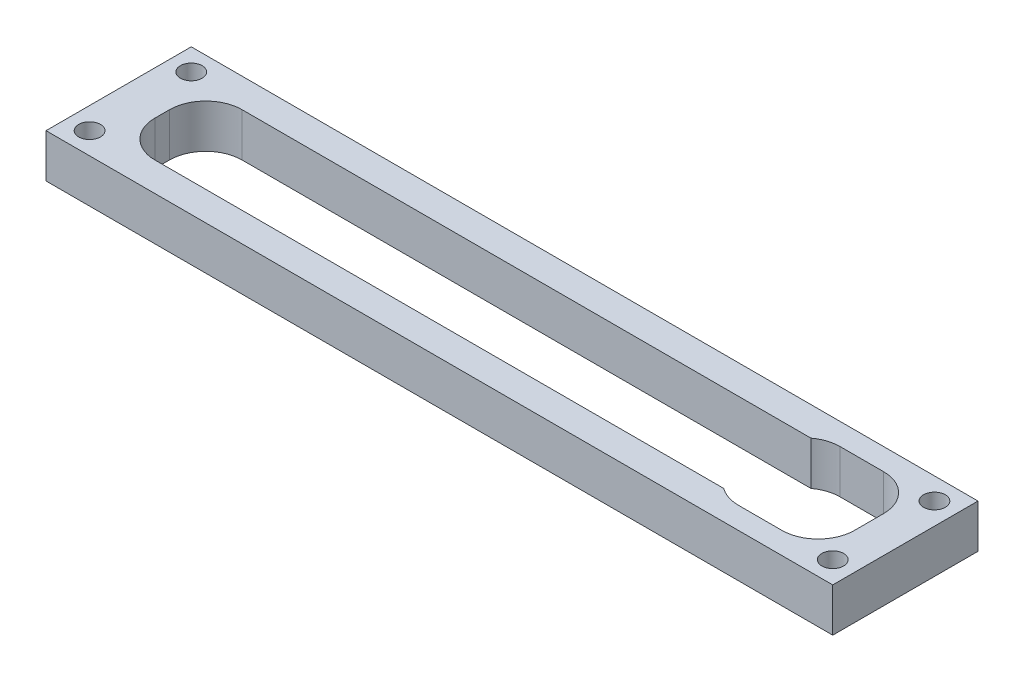
ISO-10303-21;
HEADER;
FILE_DESCRIPTION(('STEP AP214'),'2;1');
FILE_NAME('part.step','',(''),(''),'','','');
FILE_SCHEMA(('AUTOMOTIVE_DESIGN { 1 0 10303 214 1 1 1 1 }'));
ENDSEC;
DATA;
#1=APPLICATION_CONTEXT('core data for automotive mechanical design processes');
#2=APPLICATION_PROTOCOL_DEFINITION('international standard','automotive_design',2000,#1);
#3=PRODUCT_CONTEXT('',#1,'mechanical');
#4=PRODUCT('Part','Part','',(#3));
#5=PRODUCT_RELATED_PRODUCT_CATEGORY('part','',(#4));
#6=PRODUCT_DEFINITION_FORMATION('','',#4);
#7=PRODUCT_DEFINITION_CONTEXT('part definition',#1,'design');
#8=PRODUCT_DEFINITION('design','',#6,#7);
#9=PRODUCT_DEFINITION_SHAPE('','',#8);
#10=(LENGTH_UNIT() NAMED_UNIT(*) SI_UNIT(.MILLI.,.METRE.));
#11=(NAMED_UNIT(*) PLANE_ANGLE_UNIT() SI_UNIT($,.RADIAN.));
#12=(NAMED_UNIT(*) SI_UNIT($,.STERADIAN.) SOLID_ANGLE_UNIT());
#13=UNCERTAINTY_MEASURE_WITH_UNIT(LENGTH_MEASURE(1.E-05),#10,'distance_accuracy_value','');
#14=(GEOMETRIC_REPRESENTATION_CONTEXT(3) GLOBAL_UNCERTAINTY_ASSIGNED_CONTEXT((#13)) GLOBAL_UNIT_ASSIGNED_CONTEXT((#10,
#11,#12)) REPRESENTATION_CONTEXT('',''));
#15=CARTESIAN_POINT('',(0.,0.,0.));
#16=DIRECTION('',(0.,0.,1.));
#17=DIRECTION('',(1.,0.,0.));
#18=AXIS2_PLACEMENT_3D('',#15,#16,#17);
#19=CARTESIAN_POINT('',(0.,6.,0.));
#20=DIRECTION('',(0.,-1.,0.));
#21=DIRECTION('',(0.,0.,-1.));
#22=AXIS2_PLACEMENT_3D('',#19,#20,#21);
#23=PLANE('',#22);
#24=DIRECTION('',(0.,0.,1.));
#25=VECTOR('',#24,1.);
#26=CARTESIAN_POINT('',(0.,6.,0.));
#27=LINE('',#26,#25);
#28=CARTESIAN_POINT('',(0.,6.,-20.));
#29=VERTEX_POINT('',#28);
#30=CARTESIAN_POINT('',(0.,6.,0.));
#31=VERTEX_POINT('',#30);
#32=EDGE_CURVE('E250',#29,#31,#27,.T.);
#33=ORIENTED_EDGE('',*,*,#32,.T.);
#34=DIRECTION('',(1.,0.,0.));
#35=VECTOR('',#34,1.);
#36=CARTESIAN_POINT('',(0.,6.,0.));
#37=LINE('',#36,#35);
#38=CARTESIAN_POINT('',(108.320866353641,6.,0.));
#39=VERTEX_POINT('',#38);
#40=EDGE_CURVE('E253',#31,#39,#37,.T.);
#41=ORIENTED_EDGE('',*,*,#40,.T.);
#42=DIRECTION('',(0.,0.,-1.));
#43=VECTOR('',#42,1.);
#44=CARTESIAN_POINT('',(108.320866353641,6.,0.));
#45=LINE('',#44,#43);
#46=CARTESIAN_POINT('',(108.320866353641,6.,-20.));
#47=VERTEX_POINT('',#46);
#48=EDGE_CURVE('E256',#39,#47,#45,.T.);
#49=ORIENTED_EDGE('',*,*,#48,.T.);
#50=DIRECTION('',(-1.,0.,0.));
#51=VECTOR('',#50,1.);
#52=CARTESIAN_POINT('',(0.,6.,-20.));
#53=LINE('',#52,#51);
#54=EDGE_CURVE('E258',#47,#29,#53,.T.);
#55=ORIENTED_EDGE('',*,*,#54,.T.);
#56=EDGE_LOOP('',(#33,#41,#49,#55));
#57=FACE_BOUND('',#56,.T.);
#58=DIRECTION('',(-1.,0.,0.));
#59=VECTOR('',#58,1.);
#60=CARTESIAN_POINT('',(5.99999999999999,6.,-16.));
#61=LINE('',#60,#59);
#62=CARTESIAN_POINT('',(89.3208663536412,6.,-16.));
#63=VERTEX_POINT('',#62);
#64=CARTESIAN_POINT('',(11.,6.,-16.));
#65=VERTEX_POINT('',#64);
#66=EDGE_CURVE('E243',#63,#65,#61,.T.);
#67=ORIENTED_EDGE('',*,*,#66,.F.);
#68=CARTESIAN_POINT('',(92.3208663536412,6.,-12.));
#69=DIRECTION('',(0.,-1.,0.));
#70=DIRECTION('',(0.,0.,-1.));
#71=AXIS2_PLACEMENT_3D('',#68,#69,#70);
#72=CIRCLE('',#71,5.);
#73=CARTESIAN_POINT('',(92.3208663536412,6.,-17.));
#74=VERTEX_POINT('',#73);
#75=EDGE_CURVE('E193',#63,#74,#72,.T.);
#76=ORIENTED_EDGE('',*,*,#75,.T.);
#77=DIRECTION('',(-1.,0.,0.));
#78=VECTOR('',#77,1.);
#79=CARTESIAN_POINT('',(89.3208663536412,6.,-17.));
#80=LINE('',#79,#78);
#81=CARTESIAN_POINT('',(98.3208663536412,6.,-17.));
#82=VERTEX_POINT('',#81);
#83=EDGE_CURVE('E205',#82,#74,#80,.T.);
#84=ORIENTED_EDGE('',*,*,#83,.F.);
#85=CARTESIAN_POINT('',(98.3208663536412,6.,-12.));
#86=DIRECTION('',(0.,-1.,0.));
#87=DIRECTION('',(0.,0.,-1.));
#88=AXIS2_PLACEMENT_3D('',#85,#86,#87);
#89=CIRCLE('',#88,5.);
#90=CARTESIAN_POINT('',(103.320866353641,6.,-12.));
#91=VERTEX_POINT('',#90);
#92=EDGE_CURVE('E185',#82,#91,#89,.T.);
#93=ORIENTED_EDGE('',*,*,#92,.T.);
#94=DIRECTION('',(0.,0.,-1.));
#95=VECTOR('',#94,1.);
#96=CARTESIAN_POINT('',(103.320866353641,6.,-17.));
#97=LINE('',#96,#95);
#98=CARTESIAN_POINT('',(103.320866353641,6.,-8.00000000000001));
#99=VERTEX_POINT('',#98);
#100=EDGE_CURVE('E202',#99,#91,#97,.T.);
#101=ORIENTED_EDGE('',*,*,#100,.F.);
#102=CARTESIAN_POINT('',(98.3208663536412,6.,-8.00000000000001));
#103=DIRECTION('',(0.,-1.,0.));
#104=DIRECTION('',(0.,0.,-1.));
#105=AXIS2_PLACEMENT_3D('',#102,#103,#104);
#106=CIRCLE('',#105,5.);
#107=CARTESIAN_POINT('',(98.3208663536412,6.,-3.00000000000001));
#108=VERTEX_POINT('',#107);
#109=EDGE_CURVE('E189',#99,#108,#106,.T.);
#110=ORIENTED_EDGE('',*,*,#109,.T.);
#111=DIRECTION('',(1.,0.,0.));
#112=VECTOR('',#111,1.);
#113=CARTESIAN_POINT('',(89.3208663536412,6.,-3.00000000000001));
#114=LINE('',#113,#112);
#115=CARTESIAN_POINT('',(92.3208663536412,6.,-3.00000000000001));
#116=VERTEX_POINT('',#115);
#117=EDGE_CURVE('E200',#116,#108,#114,.T.);
#118=ORIENTED_EDGE('',*,*,#117,.F.);
#119=CARTESIAN_POINT('',(92.3208663536412,6.,-8.00000000000001));
#120=DIRECTION('',(0.,-1.,0.));
#121=DIRECTION('',(0.,0.,-1.));
#122=AXIS2_PLACEMENT_3D('',#119,#120,#121);
#123=CIRCLE('',#122,5.);
#124=CARTESIAN_POINT('',(89.3208663536412,6.,-4.00000000000002));
#125=VERTEX_POINT('',#124);
#126=EDGE_CURVE('E43',#116,#125,#123,.T.);
#127=ORIENTED_EDGE('',*,*,#126,.T.);
#128=DIRECTION('',(1.,0.,0.));
#129=VECTOR('',#128,1.);
#130=CARTESIAN_POINT('',(5.99999999999999,6.,-4.00000000000002));
#131=LINE('',#130,#129);
#132=CARTESIAN_POINT('',(11.,6.,-4.00000000000002));
#133=VERTEX_POINT('',#132);
#134=EDGE_CURVE('E162',#133,#125,#131,.T.);
#135=ORIENTED_EDGE('',*,*,#134,.F.);
#136=CARTESIAN_POINT('',(11.,6.,-9.00000000000001));
#137=DIRECTION('',(0.,-1.,0.));
#138=DIRECTION('',(0.,0.,-1.));
#139=AXIS2_PLACEMENT_3D('',#136,#137,#138);
#140=CIRCLE('',#139,5.);
#141=CARTESIAN_POINT('',(5.99999999999999,6.,-9.00000000000001));
#142=VERTEX_POINT('',#141);
#143=EDGE_CURVE('E179',#133,#142,#140,.T.);
#144=ORIENTED_EDGE('',*,*,#143,.T.);
#145=DIRECTION('',(0.,0.,1.));
#146=VECTOR('',#145,1.);
#147=CARTESIAN_POINT('',(5.99999999999999,6.,-16.));
#148=LINE('',#147,#146);
#149=CARTESIAN_POINT('',(5.99999999999999,6.,-11.));
#150=VERTEX_POINT('',#149);
#151=EDGE_CURVE('E239',#150,#142,#148,.T.);
#152=ORIENTED_EDGE('',*,*,#151,.F.);
#153=CARTESIAN_POINT('',(11.,6.,-11.));
#154=DIRECTION('',(0.,-1.,0.));
#155=DIRECTION('',(0.,0.,-1.));
#156=AXIS2_PLACEMENT_3D('',#153,#154,#155);
#157=CIRCLE('',#156,5.);
#158=EDGE_CURVE('E183',#150,#65,#157,.T.);
#159=ORIENTED_EDGE('',*,*,#158,.T.);
#160=EDGE_LOOP('',(#67,#76,#84,#93,#101,#110,#118,#127,#135,#144,#152,#159));
#161=FACE_BOUND('',#160,.T.);
#162=CARTESIAN_POINT('',(3.,6.,-17.));
#163=DIRECTION('',(0.,1.,0.));
#164=DIRECTION('',(0.,0.,1.));
#165=AXIS2_PLACEMENT_3D('',#162,#163,#164);
#166=CIRCLE('',#165,1.5);
#167=CARTESIAN_POINT('',(3.,6.,-15.5));
#168=VERTEX_POINT('',#167);
#169=EDGE_CURVE('E234',#168,#168,#166,.T.);
#170=ORIENTED_EDGE('',*,*,#169,.F.);
#171=EDGE_LOOP('',(#170));
#172=FACE_BOUND('',#171,.T.);
#173=CARTESIAN_POINT('',(3.,6.,-3.));
#174=DIRECTION('',(0.,1.,0.));
#175=DIRECTION('',(0.,0.,-1.));
#176=AXIS2_PLACEMENT_3D('',#173,#174,#175);
#177=CIRCLE('',#176,1.5);
#178=CARTESIAN_POINT('',(3.,6.,-4.5));
#179=VERTEX_POINT('',#178);
#180=EDGE_CURVE('E228',#179,#179,#177,.T.);
#181=ORIENTED_EDGE('',*,*,#180,.F.);
#182=EDGE_LOOP('',(#181));
#183=FACE_BOUND('',#182,.T.);
#184=CARTESIAN_POINT('',(105.320866353641,6.,-3.00000000000001));
#185=DIRECTION('',(0.,1.,0.));
#186=DIRECTION('',(0.,0.,1.));
#187=AXIS2_PLACEMENT_3D('',#184,#185,#186);
#188=CIRCLE('',#187,1.5);
#189=CARTESIAN_POINT('',(105.320866353641,6.,-1.50000000000001));
#190=VERTEX_POINT('',#189);
#191=EDGE_CURVE('E222',#190,#190,#188,.T.);
#192=ORIENTED_EDGE('',*,*,#191,.F.);
#193=EDGE_LOOP('',(#192));
#194=FACE_BOUND('',#193,.T.);
#195=CARTESIAN_POINT('',(105.320866353641,6.,-17.));
#196=DIRECTION('',(0.,1.,0.));
#197=DIRECTION('',(0.,0.,-1.));
#198=AXIS2_PLACEMENT_3D('',#195,#196,#197);
#199=CIRCLE('',#198,1.5);
#200=CARTESIAN_POINT('',(105.320866353641,6.,-18.5));
#201=VERTEX_POINT('',#200);
#202=EDGE_CURVE('E216',#201,#201,#199,.T.);
#203=ORIENTED_EDGE('',*,*,#202,.F.);
#204=EDGE_LOOP('',(#203));
#205=FACE_BOUND('',#204,.T.);
#206=ADVANCED_FACE('F35',(#57,#161,#172,#183,#194,#205),#23,.F.);
#207=CARTESIAN_POINT('',(0.,0.,0.));
#208=DIRECTION('',(0.,-1.,0.));
#209=DIRECTION('',(0.,0.,-1.));
#210=AXIS2_PLACEMENT_3D('',#207,#208,#209);
#211=PLANE('',#210);
#212=DIRECTION('',(-1.,0.,0.));
#213=VECTOR('',#212,1.);
#214=CARTESIAN_POINT('',(89.3208663536412,0.,-17.));
#215=LINE('',#214,#213);
#216=CARTESIAN_POINT('',(98.3208663536412,0.,-17.));
#217=VERTEX_POINT('',#216);
#218=CARTESIAN_POINT('',(92.3208663536412,0.,-17.));
#219=VERTEX_POINT('',#218);
#220=EDGE_CURVE('E165',#217,#219,#215,.T.);
#221=ORIENTED_EDGE('',*,*,#220,.T.);
#222=CARTESIAN_POINT('',(92.3208663536412,0.,-12.));
#223=DIRECTION('',(0.,-1.,0.));
#224=DIRECTION('',(0.,0.,-1.));
#225=AXIS2_PLACEMENT_3D('',#222,#223,#224);
#226=CIRCLE('',#225,5.);
#227=CARTESIAN_POINT('',(89.3208663536412,0.,-16.));
#228=VERTEX_POINT('',#227);
#229=EDGE_CURVE('E195',#219,#228,#226,.F.);
#230=ORIENTED_EDGE('',*,*,#229,.T.);
#231=DIRECTION('',(-1.,0.,0.));
#232=VECTOR('',#231,1.);
#233=CARTESIAN_POINT('',(5.99999999999999,0.,-16.));
#234=LINE('',#233,#232);
#235=CARTESIAN_POINT('',(11.,0.,-16.));
#236=VERTEX_POINT('',#235);
#237=EDGE_CURVE('E154',#228,#236,#234,.T.);
#238=ORIENTED_EDGE('',*,*,#237,.T.);
#239=CARTESIAN_POINT('',(11.,0.,-11.));
#240=DIRECTION('',(0.,-1.,0.));
#241=DIRECTION('',(0.,0.,-1.));
#242=AXIS2_PLACEMENT_3D('',#239,#240,#241);
#243=CIRCLE('',#242,5.);
#244=CARTESIAN_POINT('',(5.99999999999999,0.,-11.));
#245=VERTEX_POINT('',#244);
#246=EDGE_CURVE('E181',#236,#245,#243,.F.);
#247=ORIENTED_EDGE('',*,*,#246,.T.);
#248=DIRECTION('',(0.,0.,1.));
#249=VECTOR('',#248,1.);
#250=CARTESIAN_POINT('',(5.99999999999999,0.,-16.));
#251=LINE('',#250,#249);
#252=CARTESIAN_POINT('',(5.99999999999999,0.,-9.00000000000001));
#253=VERTEX_POINT('',#252);
#254=EDGE_CURVE('E155',#245,#253,#251,.T.);
#255=ORIENTED_EDGE('',*,*,#254,.T.);
#256=CARTESIAN_POINT('',(11.,0.,-9.00000000000001));
#257=DIRECTION('',(0.,-1.,0.));
#258=DIRECTION('',(0.,0.,-1.));
#259=AXIS2_PLACEMENT_3D('',#256,#257,#258);
#260=CIRCLE('',#259,5.);
#261=CARTESIAN_POINT('',(11.,0.,-4.00000000000002));
#262=VERTEX_POINT('',#261);
#263=EDGE_CURVE('E151',#253,#262,#260,.F.);
#264=ORIENTED_EDGE('',*,*,#263,.T.);
#265=DIRECTION('',(1.,0.,0.));
#266=VECTOR('',#265,1.);
#267=CARTESIAN_POINT('',(5.99999999999999,0.,-4.00000000000002));
#268=LINE('',#267,#266);
#269=CARTESIAN_POINT('',(89.3208663536412,0.,-4.00000000000002));
#270=VERTEX_POINT('',#269);
#271=EDGE_CURVE('E145',#262,#270,#268,.T.);
#272=ORIENTED_EDGE('',*,*,#271,.T.);
#273=CARTESIAN_POINT('',(92.3208663536412,0.,-8.00000000000001));
#274=DIRECTION('',(0.,-1.,0.));
#275=DIRECTION('',(0.,0.,-1.));
#276=AXIS2_PLACEMENT_3D('',#273,#274,#275);
#277=CIRCLE('',#276,5.);
#278=CARTESIAN_POINT('',(92.3208663536412,0.,-3.00000000000001));
#279=VERTEX_POINT('',#278);
#280=EDGE_CURVE('E11',#270,#279,#277,.F.);
#281=ORIENTED_EDGE('',*,*,#280,.T.);
#282=DIRECTION('',(1.,0.,0.));
#283=VECTOR('',#282,1.);
#284=CARTESIAN_POINT('',(89.3208663536412,0.,-3.00000000000001));
#285=LINE('',#284,#283);
#286=CARTESIAN_POINT('',(98.3208663536412,0.,-3.00000000000001));
#287=VERTEX_POINT('',#286);
#288=EDGE_CURVE('E212',#279,#287,#285,.T.);
#289=ORIENTED_EDGE('',*,*,#288,.T.);
#290=CARTESIAN_POINT('',(98.3208663536412,0.,-8.00000000000001));
#291=DIRECTION('',(0.,-1.,0.));
#292=DIRECTION('',(0.,0.,-1.));
#293=AXIS2_PLACEMENT_3D('',#290,#291,#292);
#294=CIRCLE('',#293,5.);
#295=CARTESIAN_POINT('',(103.320866353641,0.,-8.00000000000001));
#296=VERTEX_POINT('',#295);
#297=EDGE_CURVE('E191',#287,#296,#294,.F.);
#298=ORIENTED_EDGE('',*,*,#297,.T.);
#299=DIRECTION('',(0.,0.,-1.));
#300=VECTOR('',#299,1.);
#301=CARTESIAN_POINT('',(103.320866353641,0.,-17.));
#302=LINE('',#301,#300);
#303=CARTESIAN_POINT('',(103.320866353641,0.,-12.));
#304=VERTEX_POINT('',#303);
#305=EDGE_CURVE('E300',#296,#304,#302,.T.);
#306=ORIENTED_EDGE('',*,*,#305,.T.);
#307=CARTESIAN_POINT('',(98.3208663536412,0.,-12.));
#308=DIRECTION('',(0.,-1.,0.));
#309=DIRECTION('',(0.,0.,-1.));
#310=AXIS2_PLACEMENT_3D('',#307,#308,#309);
#311=CIRCLE('',#310,5.);
#312=EDGE_CURVE('E187',#304,#217,#311,.F.);
#313=ORIENTED_EDGE('',*,*,#312,.T.);
#314=EDGE_LOOP('',(#221,#230,#238,#247,#255,#264,#272,#281,#289,#298,#306,#313));
#315=FACE_BOUND('',#314,.T.);
#316=CARTESIAN_POINT('',(105.320866353641,0.,-3.00000000000001));
#317=DIRECTION('',(0.,1.,0.));
#318=DIRECTION('',(0.,0.,1.));
#319=AXIS2_PLACEMENT_3D('',#316,#317,#318);
#320=CIRCLE('',#319,1.5);
#321=CARTESIAN_POINT('',(105.320866353641,0.,-1.50000000000001));
#322=VERTEX_POINT('',#321);
#323=EDGE_CURVE('E219',#322,#322,#320,.T.);
#324=ORIENTED_EDGE('',*,*,#323,.T.);
#325=EDGE_LOOP('',(#324));
#326=FACE_BOUND('',#325,.T.);
#327=CARTESIAN_POINT('',(3.,0.,-17.));
#328=DIRECTION('',(0.,1.,0.));
#329=DIRECTION('',(0.,0.,1.));
#330=AXIS2_PLACEMENT_3D('',#327,#328,#329);
#331=CIRCLE('',#330,1.5);
#332=CARTESIAN_POINT('',(3.,0.,-15.5));
#333=VERTEX_POINT('',#332);
#334=EDGE_CURVE('E231',#333,#333,#331,.T.);
#335=ORIENTED_EDGE('',*,*,#334,.T.);
#336=EDGE_LOOP('',(#335));
#337=FACE_BOUND('',#336,.T.);
#338=DIRECTION('',(0.,0.,1.));
#339=VECTOR('',#338,1.);
#340=CARTESIAN_POINT('',(0.,0.,0.));
#341=LINE('',#340,#339);
#342=CARTESIAN_POINT('',(0.,0.,-20.));
#343=VERTEX_POINT('',#342);
#344=CARTESIAN_POINT('',(0.,0.,0.));
#345=VERTEX_POINT('',#344);
#346=EDGE_CURVE('E246',#343,#345,#341,.T.);
#347=ORIENTED_EDGE('',*,*,#346,.F.);
#348=DIRECTION('',(-1.,0.,0.));
#349=VECTOR('',#348,1.);
#350=CARTESIAN_POINT('',(0.,0.,-20.));
#351=LINE('',#350,#349);
#352=CARTESIAN_POINT('',(108.320866353641,0.,-20.));
#353=VERTEX_POINT('',#352);
#354=EDGE_CURVE('E254',#353,#343,#351,.T.);
#355=ORIENTED_EDGE('',*,*,#354,.F.);
#356=DIRECTION('',(0.,0.,-1.));
#357=VECTOR('',#356,1.);
#358=CARTESIAN_POINT('',(108.320866353641,0.,0.));
#359=LINE('',#358,#357);
#360=CARTESIAN_POINT('',(108.320866353641,0.,0.));
#361=VERTEX_POINT('',#360);
#362=EDGE_CURVE('E265',#361,#353,#359,.T.);
#363=ORIENTED_EDGE('',*,*,#362,.F.);
#364=DIRECTION('',(1.,0.,0.));
#365=VECTOR('',#364,1.);
#366=CARTESIAN_POINT('',(0.,0.,0.));
#367=LINE('',#366,#365);
#368=EDGE_CURVE('E263',#345,#361,#367,.T.);
#369=ORIENTED_EDGE('',*,*,#368,.F.);
#370=EDGE_LOOP('',(#347,#355,#363,#369));
#371=FACE_BOUND('',#370,.T.);
#372=CARTESIAN_POINT('',(3.,0.,-3.));
#373=DIRECTION('',(0.,1.,0.));
#374=DIRECTION('',(0.,0.,-1.));
#375=AXIS2_PLACEMENT_3D('',#372,#373,#374);
#376=CIRCLE('',#375,1.5);
#377=CARTESIAN_POINT('',(3.,0.,-4.5));
#378=VERTEX_POINT('',#377);
#379=EDGE_CURVE('E225',#378,#378,#376,.T.);
#380=ORIENTED_EDGE('',*,*,#379,.T.);
#381=EDGE_LOOP('',(#380));
#382=FACE_BOUND('',#381,.T.);
#383=CARTESIAN_POINT('',(105.320866353641,0.,-17.));
#384=DIRECTION('',(0.,1.,0.));
#385=DIRECTION('',(0.,0.,-1.));
#386=AXIS2_PLACEMENT_3D('',#383,#384,#385);
#387=CIRCLE('',#386,1.5);
#388=CARTESIAN_POINT('',(105.320866353641,0.,-18.5));
#389=VERTEX_POINT('',#388);
#390=EDGE_CURVE('E214',#389,#389,#387,.T.);
#391=ORIENTED_EDGE('',*,*,#390,.T.);
#392=EDGE_LOOP('',(#391));
#393=FACE_BOUND('',#392,.T.);
#394=ADVANCED_FACE('F148',(#315,#326,#337,#371,#382,#393),#211,.T.);
#395=CARTESIAN_POINT('',(0.,6.,0.));
#396=DIRECTION('',(1.,0.,0.));
#397=DIRECTION('',(0.,0.,-1.));
#398=AXIS2_PLACEMENT_3D('',#395,#396,#397);
#399=PLANE('',#398);
#400=ORIENTED_EDGE('',*,*,#346,.T.);
#401=DIRECTION('',(0.,-1.,0.));
#402=VECTOR('',#401,1.);
#403=CARTESIAN_POINT('',(0.,6.,0.));
#404=LINE('',#403,#402);
#405=EDGE_CURVE('E276',#31,#345,#404,.T.);
#406=ORIENTED_EDGE('',*,*,#405,.F.);
#407=ORIENTED_EDGE('',*,*,#32,.F.);
#408=DIRECTION('',(0.,-1.,0.));
#409=VECTOR('',#408,1.);
#410=CARTESIAN_POINT('',(0.,6.,-20.));
#411=LINE('',#410,#409);
#412=EDGE_CURVE('E260',#29,#343,#411,.T.);
#413=ORIENTED_EDGE('',*,*,#412,.T.);
#414=EDGE_LOOP('',(#400,#406,#407,#413));
#415=FACE_BOUND('',#414,.T.);
#416=ADVANCED_FACE('F331',(#415),#399,.F.);
#417=CARTESIAN_POINT('',(0.,6.,0.));
#418=DIRECTION('',(0.,0.,-1.));
#419=DIRECTION('',(-1.,0.,0.));
#420=AXIS2_PLACEMENT_3D('',#417,#418,#419);
#421=PLANE('',#420);
#422=ORIENTED_EDGE('',*,*,#368,.T.);
#423=DIRECTION('',(0.,-1.,0.));
#424=VECTOR('',#423,1.);
#425=CARTESIAN_POINT('',(108.320866353641,6.,0.));
#426=LINE('',#425,#424);
#427=EDGE_CURVE('E273',#39,#361,#426,.T.);
#428=ORIENTED_EDGE('',*,*,#427,.F.);
#429=ORIENTED_EDGE('',*,*,#40,.F.);
#430=ORIENTED_EDGE('',*,*,#405,.T.);
#431=EDGE_LOOP('',(#422,#428,#429,#430));
#432=FACE_BOUND('',#431,.T.);
#433=ADVANCED_FACE('F344',(#432),#421,.F.);
#434=CARTESIAN_POINT('',(108.320866353641,6.,0.));
#435=DIRECTION('',(-1.,0.,0.));
#436=DIRECTION('',(0.,0.,1.));
#437=AXIS2_PLACEMENT_3D('',#434,#435,#436);
#438=PLANE('',#437);
#439=ORIENTED_EDGE('',*,*,#362,.T.);
#440=DIRECTION('',(0.,-1.,0.));
#441=VECTOR('',#440,1.);
#442=CARTESIAN_POINT('',(108.320866353641,6.,-20.));
#443=LINE('',#442,#441);
#444=EDGE_CURVE('E270',#47,#353,#443,.T.);
#445=ORIENTED_EDGE('',*,*,#444,.F.);
#446=ORIENTED_EDGE('',*,*,#48,.F.);
#447=ORIENTED_EDGE('',*,*,#427,.T.);
#448=EDGE_LOOP('',(#439,#445,#446,#447));
#449=FACE_BOUND('',#448,.T.);
#450=ADVANCED_FACE('F340',(#449),#438,.F.);
#451=CARTESIAN_POINT('',(0.,6.,-20.));
#452=DIRECTION('',(0.,0.,1.));
#453=DIRECTION('',(1.,0.,0.));
#454=AXIS2_PLACEMENT_3D('',#451,#452,#453);
#455=PLANE('',#454);
#456=ORIENTED_EDGE('',*,*,#354,.T.);
#457=ORIENTED_EDGE('',*,*,#412,.F.);
#458=ORIENTED_EDGE('',*,*,#54,.F.);
#459=ORIENTED_EDGE('',*,*,#444,.T.);
#460=EDGE_LOOP('',(#456,#457,#458,#459));
#461=FACE_BOUND('',#460,.T.);
#462=ADVANCED_FACE('F337',(#461),#455,.F.);
#463=CARTESIAN_POINT('',(5.99999999999999,6.,-16.));
#464=DIRECTION('',(1.,0.,0.));
#465=DIRECTION('',(0.,0.,-1.));
#466=AXIS2_PLACEMENT_3D('',#463,#464,#465);
#467=PLANE('',#466);
#468=ORIENTED_EDGE('',*,*,#151,.T.);
#469=DIRECTION('',(0.,-1.,0.));
#470=VECTOR('',#469,1.);
#471=CARTESIAN_POINT('',(5.99999999999999,0.,-9.00000000000001));
#472=LINE('',#471,#470);
#473=EDGE_CURVE('E281',#142,#253,#472,.T.);
#474=ORIENTED_EDGE('',*,*,#473,.T.);
#475=ORIENTED_EDGE('',*,*,#254,.F.);
#476=DIRECTION('',(0.,-1.,0.));
#477=VECTOR('',#476,1.);
#478=CARTESIAN_POINT('',(5.99999999999999,6.,-11.));
#479=LINE('',#478,#477);
#480=EDGE_CURVE('E279',#245,#150,#479,.F.);
#481=ORIENTED_EDGE('',*,*,#480,.T.);
#482=EDGE_LOOP('',(#468,#474,#475,#481));
#483=FACE_BOUND('',#482,.T.);
#484=ADVANCED_FACE('F334',(#483),#467,.T.);
#485=CARTESIAN_POINT('',(5.99999999999999,6.,-4.00000000000002));
#486=DIRECTION('',(0.,0.,-1.));
#487=DIRECTION('',(-1.,0.,0.));
#488=AXIS2_PLACEMENT_3D('',#485,#486,#487);
#489=PLANE('',#488);
#490=ORIENTED_EDGE('',*,*,#271,.F.);
#491=DIRECTION('',(0.,-1.,0.));
#492=VECTOR('',#491,1.);
#493=CARTESIAN_POINT('',(11.,6.,-4.00000000000002));
#494=LINE('',#493,#492);
#495=EDGE_CURVE('E284',#262,#133,#494,.F.);
#496=ORIENTED_EDGE('',*,*,#495,.T.);
#497=ORIENTED_EDGE('',*,*,#134,.T.);
#498=DIRECTION('',(0.,1.,0.));
#499=VECTOR('',#498,1.);
#500=CARTESIAN_POINT('',(89.3208663536412,0.,-4.00000000000002));
#501=LINE('',#500,#499);
#502=EDGE_CURVE('E159',#270,#125,#501,.T.);
#503=ORIENTED_EDGE('',*,*,#502,.F.);
#504=EDGE_LOOP('',(#490,#496,#497,#503));
#505=FACE_BOUND('',#504,.T.);
#506=ADVANCED_FACE('F160',(#505),#489,.T.);
#507=CARTESIAN_POINT('',(5.99999999999999,6.,-16.));
#508=DIRECTION('',(0.,0.,1.));
#509=DIRECTION('',(1.,0.,0.));
#510=AXIS2_PLACEMENT_3D('',#507,#508,#509);
#511=PLANE('',#510);
#512=ORIENTED_EDGE('',*,*,#66,.T.);
#513=DIRECTION('',(0.,-1.,0.));
#514=VECTOR('',#513,1.);
#515=CARTESIAN_POINT('',(11.,0.,-16.));
#516=LINE('',#515,#514);
#517=EDGE_CURVE('E286',#65,#236,#516,.T.);
#518=ORIENTED_EDGE('',*,*,#517,.T.);
#519=ORIENTED_EDGE('',*,*,#237,.F.);
#520=DIRECTION('',(0.,1.,0.));
#521=VECTOR('',#520,1.);
#522=CARTESIAN_POINT('',(89.3208663536412,0.,-16.));
#523=LINE('',#522,#521);
#524=EDGE_CURVE('E164',#228,#63,#523,.T.);
#525=ORIENTED_EDGE('',*,*,#524,.T.);
#526=EDGE_LOOP('',(#512,#518,#519,#525));
#527=FACE_BOUND('',#526,.T.);
#528=ADVANCED_FACE('F366',(#527),#511,.T.);
#529=CARTESIAN_POINT('',(3.,6.,-17.));
#530=DIRECTION('',(0.,-1.,0.));
#531=DIRECTION('',(0.,0.,-1.));
#532=AXIS2_PLACEMENT_3D('',#529,#530,#531);
#533=CYLINDRICAL_SURFACE('',#532,1.5);
#534=ORIENTED_EDGE('',*,*,#169,.T.);
#535=EDGE_LOOP('',(#534));
#536=FACE_BOUND('',#535,.T.);
#537=ORIENTED_EDGE('',*,*,#334,.F.);
#538=EDGE_LOOP('',(#537));
#539=FACE_BOUND('',#538,.T.);
#540=ADVANCED_FACE('F379',(#536,#539),#533,.F.);
#541=CARTESIAN_POINT('',(3.,6.,-3.));
#542=DIRECTION('',(0.,-1.,0.));
#543=DIRECTION('',(0.,0.,-1.));
#544=AXIS2_PLACEMENT_3D('',#541,#542,#543);
#545=CYLINDRICAL_SURFACE('',#544,1.5);
#546=ORIENTED_EDGE('',*,*,#180,.T.);
#547=EDGE_LOOP('',(#546));
#548=FACE_BOUND('',#547,.T.);
#549=ORIENTED_EDGE('',*,*,#379,.F.);
#550=EDGE_LOOP('',(#549));
#551=FACE_BOUND('',#550,.T.);
#552=ADVANCED_FACE('F384',(#548,#551),#545,.F.);
#553=CARTESIAN_POINT('',(105.320866353641,6.,-3.00000000000001));
#554=DIRECTION('',(0.,-1.,0.));
#555=DIRECTION('',(0.,0.,-1.));
#556=AXIS2_PLACEMENT_3D('',#553,#554,#555);
#557=CYLINDRICAL_SURFACE('',#556,1.5);
#558=ORIENTED_EDGE('',*,*,#191,.T.);
#559=EDGE_LOOP('',(#558));
#560=FACE_BOUND('',#559,.T.);
#561=ORIENTED_EDGE('',*,*,#323,.F.);
#562=EDGE_LOOP('',(#561));
#563=FACE_BOUND('',#562,.T.);
#564=ADVANCED_FACE('F388',(#560,#563),#557,.F.);
#565=CARTESIAN_POINT('',(105.320866353641,6.,-17.));
#566=DIRECTION('',(0.,-1.,0.));
#567=DIRECTION('',(0.,0.,-1.));
#568=AXIS2_PLACEMENT_3D('',#565,#566,#567);
#569=CYLINDRICAL_SURFACE('',#568,1.5);
#570=ORIENTED_EDGE('',*,*,#202,.T.);
#571=EDGE_LOOP('',(#570));
#572=FACE_BOUND('',#571,.T.);
#573=ORIENTED_EDGE('',*,*,#390,.F.);
#574=EDGE_LOOP('',(#573));
#575=FACE_BOUND('',#574,.T.);
#576=ADVANCED_FACE('F392',(#572,#575),#569,.F.);
#577=CARTESIAN_POINT('',(89.3208663536412,0.,-17.));
#578=DIRECTION('',(0.,0.,-1.));
#579=DIRECTION('',(-1.,0.,0.));
#580=AXIS2_PLACEMENT_3D('',#577,#578,#579);
#581=PLANE('',#580);
#582=ORIENTED_EDGE('',*,*,#220,.F.);
#583=DIRECTION('',(0.,1.,0.));
#584=VECTOR('',#583,1.);
#585=CARTESIAN_POINT('',(98.3208663536412,6.,-17.));
#586=LINE('',#585,#584);
#587=EDGE_CURVE('E291',#217,#82,#586,.T.);
#588=ORIENTED_EDGE('',*,*,#587,.T.);
#589=ORIENTED_EDGE('',*,*,#83,.T.);
#590=DIRECTION('',(0.,1.,0.));
#591=VECTOR('',#590,1.);
#592=CARTESIAN_POINT('',(92.3208663536412,0.,-17.));
#593=LINE('',#592,#591);
#594=EDGE_CURVE('E289',#74,#219,#593,.F.);
#595=ORIENTED_EDGE('',*,*,#594,.T.);
#596=EDGE_LOOP('',(#582,#588,#589,#595));
#597=FACE_BOUND('',#596,.T.);
#598=ADVANCED_FACE('F310',(#597),#581,.F.);
#599=CARTESIAN_POINT('',(103.320866353641,0.,-17.));
#600=DIRECTION('',(1.,0.,0.));
#601=DIRECTION('',(0.,0.,-1.));
#602=AXIS2_PLACEMENT_3D('',#599,#600,#601);
#603=PLANE('',#602);
#604=ORIENTED_EDGE('',*,*,#100,.T.);
#605=DIRECTION('',(0.,1.,0.));
#606=VECTOR('',#605,1.);
#607=CARTESIAN_POINT('',(103.320866353641,0.,-12.));
#608=LINE('',#607,#606);
#609=EDGE_CURVE('E171',#91,#304,#608,.F.);
#610=ORIENTED_EDGE('',*,*,#609,.T.);
#611=ORIENTED_EDGE('',*,*,#305,.F.);
#612=DIRECTION('',(0.,1.,0.));
#613=VECTOR('',#612,1.);
#614=CARTESIAN_POINT('',(103.320866353641,6.,-8.00000000000001));
#615=LINE('',#614,#613);
#616=EDGE_CURVE('E174',#296,#99,#615,.T.);
#617=ORIENTED_EDGE('',*,*,#616,.T.);
#618=EDGE_LOOP('',(#604,#610,#611,#617));
#619=FACE_BOUND('',#618,.T.);
#620=ADVANCED_FACE('F297',(#619),#603,.F.);
#621=CARTESIAN_POINT('',(89.3208663536412,0.,-3.00000000000001));
#622=DIRECTION('',(0.,0.,1.));
#623=DIRECTION('',(1.,0.,0.));
#624=AXIS2_PLACEMENT_3D('',#621,#622,#623);
#625=PLANE('',#624);
#626=ORIENTED_EDGE('',*,*,#117,.T.);
#627=DIRECTION('',(0.,1.,0.));
#628=VECTOR('',#627,1.);
#629=CARTESIAN_POINT('',(98.3208663536412,0.,-3.00000000000001));
#630=LINE('',#629,#628);
#631=EDGE_CURVE('E50',#108,#287,#630,.F.);
#632=ORIENTED_EDGE('',*,*,#631,.T.);
#633=ORIENTED_EDGE('',*,*,#288,.F.);
#634=DIRECTION('',(0.,-1.,0.));
#635=VECTOR('',#634,1.);
#636=CARTESIAN_POINT('',(92.3208663536412,0.,-3.00000000000001));
#637=LINE('',#636,#635);
#638=EDGE_CURVE('E169',#279,#116,#637,.F.);
#639=ORIENTED_EDGE('',*,*,#638,.T.);
#640=EDGE_LOOP('',(#626,#632,#633,#639));
#641=FACE_BOUND('',#640,.T.);
#642=ADVANCED_FACE('F355',(#641),#625,.F.);
#643=CARTESIAN_POINT('',(11.,6.,-9.00000000000001));
#644=DIRECTION('',(0.,1.,0.));
#645=DIRECTION('',(0.,0.,1.));
#646=AXIS2_PLACEMENT_3D('',#643,#644,#645);
#647=CYLINDRICAL_SURFACE('',#646,5.);
#648=ORIENTED_EDGE('',*,*,#143,.F.);
#649=ORIENTED_EDGE('',*,*,#495,.F.);
#650=ORIENTED_EDGE('',*,*,#263,.F.);
#651=ORIENTED_EDGE('',*,*,#473,.F.);
#652=EDGE_LOOP('',(#648,#649,#650,#651));
#653=FACE_BOUND('',#652,.T.);
#654=ADVANCED_FACE('F352',(#653),#647,.F.);
#655=CARTESIAN_POINT('',(11.,6.,-11.));
#656=DIRECTION('',(0.,1.,0.));
#657=DIRECTION('',(0.,0.,1.));
#658=AXIS2_PLACEMENT_3D('',#655,#656,#657);
#659=CYLINDRICAL_SURFACE('',#658,5.);
#660=ORIENTED_EDGE('',*,*,#158,.F.);
#661=ORIENTED_EDGE('',*,*,#480,.F.);
#662=ORIENTED_EDGE('',*,*,#246,.F.);
#663=ORIENTED_EDGE('',*,*,#517,.F.);
#664=EDGE_LOOP('',(#660,#661,#662,#663));
#665=FACE_BOUND('',#664,.T.);
#666=ADVANCED_FACE('F323',(#665),#659,.F.);
#667=CARTESIAN_POINT('',(98.3208663536412,0.,-12.));
#668=DIRECTION('',(0.,-1.,0.));
#669=DIRECTION('',(0.,0.,-1.));
#670=AXIS2_PLACEMENT_3D('',#667,#668,#669);
#671=CYLINDRICAL_SURFACE('',#670,5.);
#672=ORIENTED_EDGE('',*,*,#312,.F.);
#673=ORIENTED_EDGE('',*,*,#609,.F.);
#674=ORIENTED_EDGE('',*,*,#92,.F.);
#675=ORIENTED_EDGE('',*,*,#587,.F.);
#676=EDGE_LOOP('',(#672,#673,#674,#675));
#677=FACE_BOUND('',#676,.T.);
#678=ADVANCED_FACE('F307',(#677),#671,.F.);
#679=CARTESIAN_POINT('',(98.3208663536412,0.,-8.00000000000001));
#680=DIRECTION('',(0.,-1.,0.));
#681=DIRECTION('',(0.,0.,-1.));
#682=AXIS2_PLACEMENT_3D('',#679,#680,#681);
#683=CYLINDRICAL_SURFACE('',#682,5.);
#684=ORIENTED_EDGE('',*,*,#297,.F.);
#685=ORIENTED_EDGE('',*,*,#631,.F.);
#686=ORIENTED_EDGE('',*,*,#109,.F.);
#687=ORIENTED_EDGE('',*,*,#616,.F.);
#688=EDGE_LOOP('',(#684,#685,#686,#687));
#689=FACE_BOUND('',#688,.T.);
#690=ADVANCED_FACE('F314',(#689),#683,.F.);
#691=CARTESIAN_POINT('',(92.3208663536412,0.,-12.));
#692=DIRECTION('',(0.,1.,0.));
#693=DIRECTION('',(0.,0.,1.));
#694=AXIS2_PLACEMENT_3D('',#691,#692,#693);
#695=CYLINDRICAL_SURFACE('',#694,5.);
#696=ORIENTED_EDGE('',*,*,#229,.F.);
#697=ORIENTED_EDGE('',*,*,#594,.F.);
#698=ORIENTED_EDGE('',*,*,#75,.F.);
#699=ORIENTED_EDGE('',*,*,#524,.F.);
#700=EDGE_LOOP('',(#696,#697,#698,#699));
#701=FACE_BOUND('',#700,.T.);
#702=ADVANCED_FACE('F316',(#701),#695,.F.);
#703=CARTESIAN_POINT('',(92.3208663536412,0.,-8.00000000000001));
#704=DIRECTION('',(0.,-1.,0.));
#705=DIRECTION('',(0.,0.,-1.));
#706=AXIS2_PLACEMENT_3D('',#703,#704,#705);
#707=CYLINDRICAL_SURFACE('',#706,5.);
#708=ORIENTED_EDGE('',*,*,#280,.F.);
#709=ORIENTED_EDGE('',*,*,#502,.T.);
#710=ORIENTED_EDGE('',*,*,#126,.F.);
#711=ORIENTED_EDGE('',*,*,#638,.F.);
#712=EDGE_LOOP('',(#708,#709,#710,#711));
#713=FACE_BOUND('',#712,.T.);
#714=ADVANCED_FACE('F37',(#713),#707,.F.);
#715=CLOSED_SHELL('',(#206,#394,#416,#433,#450,#462,#484,#506,#528,#540,#552,#564,#576,#598,
#620,#642,#654,#666,#678,#690,#702,#714));
#716=MANIFOLD_SOLID_BREP('B2',#715);
#717=ADVANCED_BREP_SHAPE_REPRESENTATION('',(#18,#716),#14);
#718=SHAPE_DEFINITION_REPRESENTATION(#9,#717);
ENDSEC;
END-ISO-10303-21;
